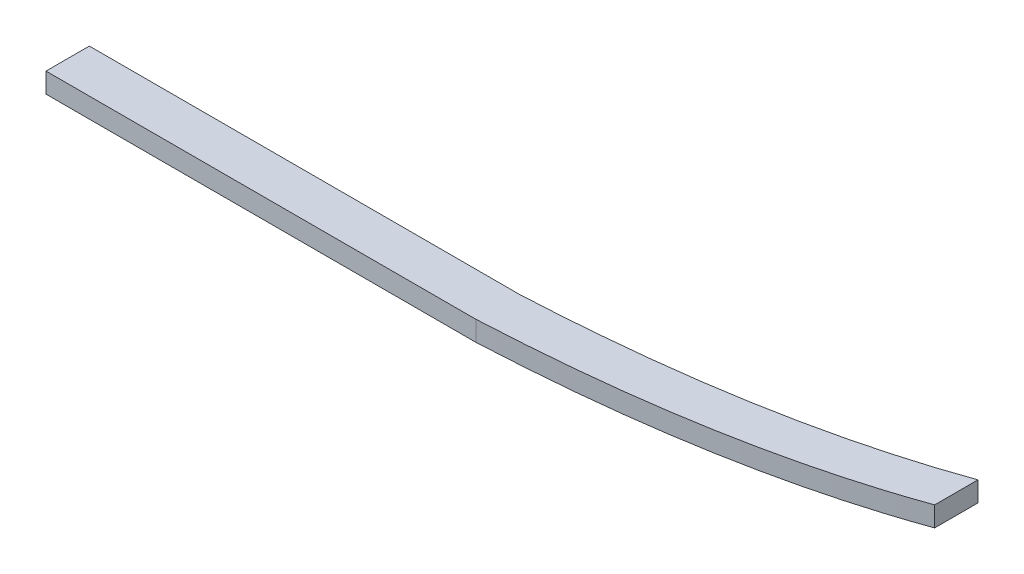
ISO-10303-21;
HEADER;
FILE_DESCRIPTION(('STEP AP214'),'2;1');
FILE_NAME('part.step','',(''),(''),'','','');
FILE_SCHEMA(('AUTOMOTIVE_DESIGN { 1 0 10303 214 1 1 1 1 }'));
ENDSEC;
DATA;
#1=APPLICATION_CONTEXT('core data for automotive mechanical design processes');
#2=APPLICATION_PROTOCOL_DEFINITION('international standard','automotive_design',2000,#1);
#3=PRODUCT_CONTEXT('',#1,'mechanical');
#4=PRODUCT('Part','Part','',(#3));
#5=PRODUCT_RELATED_PRODUCT_CATEGORY('part','',(#4));
#6=PRODUCT_DEFINITION_FORMATION('','',#4);
#7=PRODUCT_DEFINITION_CONTEXT('part definition',#1,'design');
#8=PRODUCT_DEFINITION('design','',#6,#7);
#9=PRODUCT_DEFINITION_SHAPE('','',#8);
#10=(LENGTH_UNIT() NAMED_UNIT(*) SI_UNIT(.MILLI.,.METRE.));
#11=(NAMED_UNIT(*) PLANE_ANGLE_UNIT() SI_UNIT($,.RADIAN.));
#12=(NAMED_UNIT(*) SI_UNIT($,.STERADIAN.) SOLID_ANGLE_UNIT());
#13=UNCERTAINTY_MEASURE_WITH_UNIT(LENGTH_MEASURE(1.E-05),#10,'distance_accuracy_value','');
#14=(GEOMETRIC_REPRESENTATION_CONTEXT(3) GLOBAL_UNCERTAINTY_ASSIGNED_CONTEXT((#13)) GLOBAL_UNIT_ASSIGNED_CONTEXT((#10,
#11,#12)) REPRESENTATION_CONTEXT('',''));
#15=CARTESIAN_POINT('',(0.,0.,0.));
#16=DIRECTION('',(0.,0.,1.));
#17=DIRECTION('',(1.,0.,0.));
#18=AXIS2_PLACEMENT_3D('',#15,#16,#17);
#19=CARTESIAN_POINT('',(0.,3.,0.));
#20=DIRECTION('',(0.,0.,-1.));
#21=DIRECTION('',(-1.,0.,0.));
#22=AXIS2_PLACEMENT_3D('',#19,#20,#21);
#23=PLANE('',#22);
#24=DIRECTION('',(1.,0.,0.));
#25=VECTOR('',#24,1.);
#26=CARTESIAN_POINT('',(0.,0.,0.));
#27=LINE('',#26,#25);
#28=CARTESIAN_POINT('',(-3.,0.,0.));
#29=VERTEX_POINT('',#28);
#30=CARTESIAN_POINT('',(61.5,0.,0.));
#31=VERTEX_POINT('',#30);
#32=EDGE_CURVE('E86',#29,#31,#27,.T.);
#33=ORIENTED_EDGE('',*,*,#32,.T.);
#34=DIRECTION('',(0.,-1.,0.));
#35=VECTOR('',#34,1.);
#36=CARTESIAN_POINT('',(61.5,3.,0.));
#37=LINE('',#36,#35);
#38=CARTESIAN_POINT('',(61.5,3.,0.));
#39=VERTEX_POINT('',#38);
#40=EDGE_CURVE('E12',#39,#31,#37,.T.);
#41=ORIENTED_EDGE('',*,*,#40,.F.);
#42=DIRECTION('',(1.,0.,0.));
#43=VECTOR('',#42,1.);
#44=CARTESIAN_POINT('',(-3.,3.,0.));
#45=LINE('',#44,#43);
#46=CARTESIAN_POINT('',(-3.,3.,0.));
#47=VERTEX_POINT('',#46);
#48=EDGE_CURVE('E92',#47,#39,#45,.T.);
#49=ORIENTED_EDGE('',*,*,#48,.F.);
#50=DIRECTION('',(0.,-1.,0.));
#51=VECTOR('',#50,1.);
#52=CARTESIAN_POINT('',(-3.,3.,0.));
#53=LINE('',#52,#51);
#54=EDGE_CURVE('E125',#47,#29,#53,.T.);
#55=ORIENTED_EDGE('',*,*,#54,.T.);
#56=EDGE_LOOP('',(#33,#41,#49,#55));
#57=FACE_BOUND('',#56,.T.);
#58=ADVANCED_FACE('F40',(#57),#23,.F.);
#59=CARTESIAN_POINT('',(61.5,3.,0.));
#60=CARTESIAN_POINT('',(96.0798685763207,3.,-1.68994550364377));
#61=CARTESIAN_POINT('',(120.026085552251,3.,-10.3));
#62=B_SPLINE_CURVE_WITH_KNOTS('',2,(#59,#60,#61),.UNSPECIFIED.,.F.,.F.,(3,3),(0.,1.),.UNSPECIFIED.);
#63=DIRECTION('',(0.,-1.,0.));
#64=VECTOR('',#63,1.);
#65=SURFACE_OF_LINEAR_EXTRUSION('',#62,#64);
#66=CARTESIAN_POINT('',(61.5,0.,0.));
#67=CARTESIAN_POINT('',(96.0798685763207,0.,-1.68994550364377));
#68=CARTESIAN_POINT('',(120.026085552251,0.,-10.3));
#69=B_SPLINE_CURVE_WITH_KNOTS('',2,(#66,#67,#68),.UNSPECIFIED.,.F.,.F.,(3,3),(0.,1.),.UNSPECIFIED.);
#70=CARTESIAN_POINT('',(120.026085552251,0.,-10.3));
#71=VERTEX_POINT('',#70);
#72=EDGE_CURVE('E180',#31,#71,#69,.T.);
#73=ORIENTED_EDGE('',*,*,#72,.T.);
#74=DIRECTION('',(0.,-1.,0.));
#75=VECTOR('',#74,1.);
#76=CARTESIAN_POINT('',(120.026085552251,3.,-10.3));
#77=LINE('',#76,#75);
#78=CARTESIAN_POINT('',(120.026085552251,3.,-10.3));
#79=VERTEX_POINT('',#78);
#80=EDGE_CURVE('E49',#79,#71,#77,.T.);
#81=ORIENTED_EDGE('',*,*,#80,.F.);
#82=EDGE_CURVE('E140',#39,#79,#62,.T.);
#83=ORIENTED_EDGE('',*,*,#82,.F.);
#84=ORIENTED_EDGE('',*,*,#40,.T.);
#85=EDGE_LOOP('',(#73,#81,#83,#84));
#86=FACE_BOUND('',#85,.T.);
#87=ADVANCED_FACE('F151',(#86),#65,.F.);
#88=CARTESIAN_POINT('',(120.026085552251,3.,-10.3));
#89=DIRECTION('',(-0.999999915307352,0.,-0.000411564441629204));
#90=DIRECTION('',(-0.000411564441629204,0.,0.999999915307352));
#91=AXIS2_PLACEMENT_3D('',#88,#89,#90);
#92=PLANE('',#91);
#93=DIRECTION('',(0.000411564441629204,0.,-0.999999915307352));
#94=VECTOR('',#93,1.);
#95=CARTESIAN_POINT('',(120.026085552251,0.,-10.3));
#96=LINE('',#95,#94);
#97=CARTESIAN_POINT('',(120.028762052625,0.,-16.8032346736297));
#98=VERTEX_POINT('',#97);
#99=EDGE_CURVE('E184',#71,#98,#96,.T.);
#100=ORIENTED_EDGE('',*,*,#99,.T.);
#101=DIRECTION('',(0.,-1.,0.));
#102=VECTOR('',#101,1.);
#103=CARTESIAN_POINT('',(120.028762052625,3.,-16.8032346736297));
#104=LINE('',#103,#102);
#105=CARTESIAN_POINT('',(120.028762052625,3.,-16.8032346736297));
#106=VERTEX_POINT('',#105);
#107=EDGE_CURVE('E118',#106,#98,#104,.T.);
#108=ORIENTED_EDGE('',*,*,#107,.F.);
#109=DIRECTION('',(0.000411564441629204,0.,-0.999999915307352));
#110=VECTOR('',#109,1.);
#111=CARTESIAN_POINT('',(120.026085552251,3.,-10.3));
#112=LINE('',#111,#110);
#113=EDGE_CURVE('E106',#79,#106,#112,.T.);
#114=ORIENTED_EDGE('',*,*,#113,.F.);
#115=ORIENTED_EDGE('',*,*,#80,.T.);
#116=EDGE_LOOP('',(#100,#108,#114,#115));
#117=FACE_BOUND('',#116,.T.);
#118=ADVANCED_FACE('F154',(#117),#92,.F.);
#119=CARTESIAN_POINT('',(120.028762052625,3.,-16.8032346736297));
#120=CARTESIAN_POINT('',(96.0825450766947,3.,-8.19318017727344));
#121=CARTESIAN_POINT('',(61.5,3.,-6.5));
#122=B_SPLINE_CURVE_WITH_KNOTS('',2,(#119,#120,#121),.UNSPECIFIED.,.F.,.F.,(3,3),(0.,1.),.UNSPECIFIED.);
#123=DIRECTION('',(0.,-1.,0.));
#124=VECTOR('',#123,1.);
#125=SURFACE_OF_LINEAR_EXTRUSION('',#122,#124);
#126=CARTESIAN_POINT('',(120.028762052625,0.,-16.8032346736297));
#127=CARTESIAN_POINT('',(96.0825450766947,0.,-8.19318017727344));
#128=CARTESIAN_POINT('',(61.5,0.,-6.5));
#129=B_SPLINE_CURVE_WITH_KNOTS('',2,(#126,#127,#128),.UNSPECIFIED.,.F.,.F.,(3,3),(0.,1.),.UNSPECIFIED.);
#130=CARTESIAN_POINT('',(61.5,0.,-6.5));
#131=VERTEX_POINT('',#130);
#132=EDGE_CURVE('E116',#98,#131,#129,.T.);
#133=ORIENTED_EDGE('',*,*,#132,.T.);
#134=DIRECTION('',(0.,-1.,0.));
#135=VECTOR('',#134,1.);
#136=CARTESIAN_POINT('',(61.5,3.,-6.5));
#137=LINE('',#136,#135);
#138=CARTESIAN_POINT('',(61.5,3.,-6.5));
#139=VERTEX_POINT('',#138);
#140=EDGE_CURVE('E113',#139,#131,#137,.T.);
#141=ORIENTED_EDGE('',*,*,#140,.F.);
#142=EDGE_CURVE('E100',#106,#139,#122,.T.);
#143=ORIENTED_EDGE('',*,*,#142,.F.);
#144=ORIENTED_EDGE('',*,*,#107,.T.);
#145=EDGE_LOOP('',(#133,#141,#143,#144));
#146=FACE_BOUND('',#145,.T.);
#147=ADVANCED_FACE('F114',(#146),#125,.F.);
#148=CARTESIAN_POINT('',(0.,3.,-6.5));
#149=DIRECTION('',(0.,0.,1.));
#150=DIRECTION('',(1.,0.,0.));
#151=AXIS2_PLACEMENT_3D('',#148,#149,#150);
#152=PLANE('',#151);
#153=DIRECTION('',(-1.,0.,0.));
#154=VECTOR('',#153,1.);
#155=CARTESIAN_POINT('',(0.,0.,-6.5));
#156=LINE('',#155,#154);
#157=CARTESIAN_POINT('',(-3.,0.,-6.5));
#158=VERTEX_POINT('',#157);
#159=EDGE_CURVE('E79',#131,#158,#156,.T.);
#160=ORIENTED_EDGE('',*,*,#159,.T.);
#161=DIRECTION('',(0.,-1.,0.));
#162=VECTOR('',#161,1.);
#163=CARTESIAN_POINT('',(-3.,3.,-6.5));
#164=LINE('',#163,#162);
#165=CARTESIAN_POINT('',(-3.,3.,-6.5));
#166=VERTEX_POINT('',#165);
#167=EDGE_CURVE('E119',#166,#158,#164,.T.);
#168=ORIENTED_EDGE('',*,*,#167,.F.);
#169=DIRECTION('',(-1.,0.,0.));
#170=VECTOR('',#169,1.);
#171=CARTESIAN_POINT('',(0.,3.,-6.5));
#172=LINE('',#171,#170);
#173=EDGE_CURVE('E104',#139,#166,#172,.T.);
#174=ORIENTED_EDGE('',*,*,#173,.F.);
#175=ORIENTED_EDGE('',*,*,#140,.T.);
#176=EDGE_LOOP('',(#160,#168,#174,#175));
#177=FACE_BOUND('',#176,.T.);
#178=ADVANCED_FACE('F121',(#177),#152,.F.);
#179=CARTESIAN_POINT('',(-3.,3.,-6.5));
#180=DIRECTION('',(1.,0.,0.));
#181=DIRECTION('',(0.,0.,-1.));
#182=AXIS2_PLACEMENT_3D('',#179,#180,#181);
#183=PLANE('',#182);
#184=DIRECTION('',(0.,0.,1.));
#185=VECTOR('',#184,1.);
#186=CARTESIAN_POINT('',(-3.,0.,-6.5));
#187=LINE('',#186,#185);
#188=EDGE_CURVE('E204',#158,#29,#187,.T.);
#189=ORIENTED_EDGE('',*,*,#188,.T.);
#190=ORIENTED_EDGE('',*,*,#54,.F.);
#191=DIRECTION('',(0.,0.,1.));
#192=VECTOR('',#191,1.);
#193=CARTESIAN_POINT('',(-3.,3.,-6.5));
#194=LINE('',#193,#192);
#195=EDGE_CURVE('E57',#166,#47,#194,.T.);
#196=ORIENTED_EDGE('',*,*,#195,.F.);
#197=ORIENTED_EDGE('',*,*,#167,.T.);
#198=EDGE_LOOP('',(#189,#190,#196,#197));
#199=FACE_BOUND('',#198,.T.);
#200=ADVANCED_FACE('F163',(#199),#183,.F.);
#201=CARTESIAN_POINT('',(93.4214556762232,3.,-3.41997275182188));
#202=DIRECTION('',(0.,-1.,0.));
#203=DIRECTION('',(0.,0.,-1.));
#204=AXIS2_PLACEMENT_3D('',#201,#202,#203);
#205=PLANE('',#204);
#206=ORIENTED_EDGE('',*,*,#48,.T.);
#207=ORIENTED_EDGE('',*,*,#82,.T.);
#208=ORIENTED_EDGE('',*,*,#113,.T.);
#209=ORIENTED_EDGE('',*,*,#142,.T.);
#210=ORIENTED_EDGE('',*,*,#173,.T.);
#211=ORIENTED_EDGE('',*,*,#195,.T.);
#212=EDGE_LOOP('',(#206,#207,#208,#209,#210,#211));
#213=FACE_BOUND('',#212,.T.);
#214=ADVANCED_FACE('F102',(#213),#205,.F.);
#215=CARTESIAN_POINT('',(93.4214556762232,0.,-3.41997275182188));
#216=DIRECTION('',(0.,-1.,0.));
#217=DIRECTION('',(0.,0.,-1.));
#218=AXIS2_PLACEMENT_3D('',#215,#216,#217);
#219=PLANE('',#218);
#220=ORIENTED_EDGE('',*,*,#32,.F.);
#221=ORIENTED_EDGE('',*,*,#188,.F.);
#222=ORIENTED_EDGE('',*,*,#159,.F.);
#223=ORIENTED_EDGE('',*,*,#132,.F.);
#224=ORIENTED_EDGE('',*,*,#99,.F.);
#225=ORIENTED_EDGE('',*,*,#72,.F.);
#226=EDGE_LOOP('',(#220,#221,#222,#223,#224,#225));
#227=FACE_BOUND('',#226,.T.);
#228=ADVANCED_FACE('F167',(#227),#219,.T.);
#229=CLOSED_SHELL('',(#58,#87,#118,#147,#178,#200,#214,#228));
#230=MANIFOLD_SOLID_BREP('B2',#229);
#231=ADVANCED_BREP_SHAPE_REPRESENTATION('',(#18,#230),#14);
#232=SHAPE_DEFINITION_REPRESENTATION(#9,#231);
ENDSEC;
END-ISO-10303-21;
